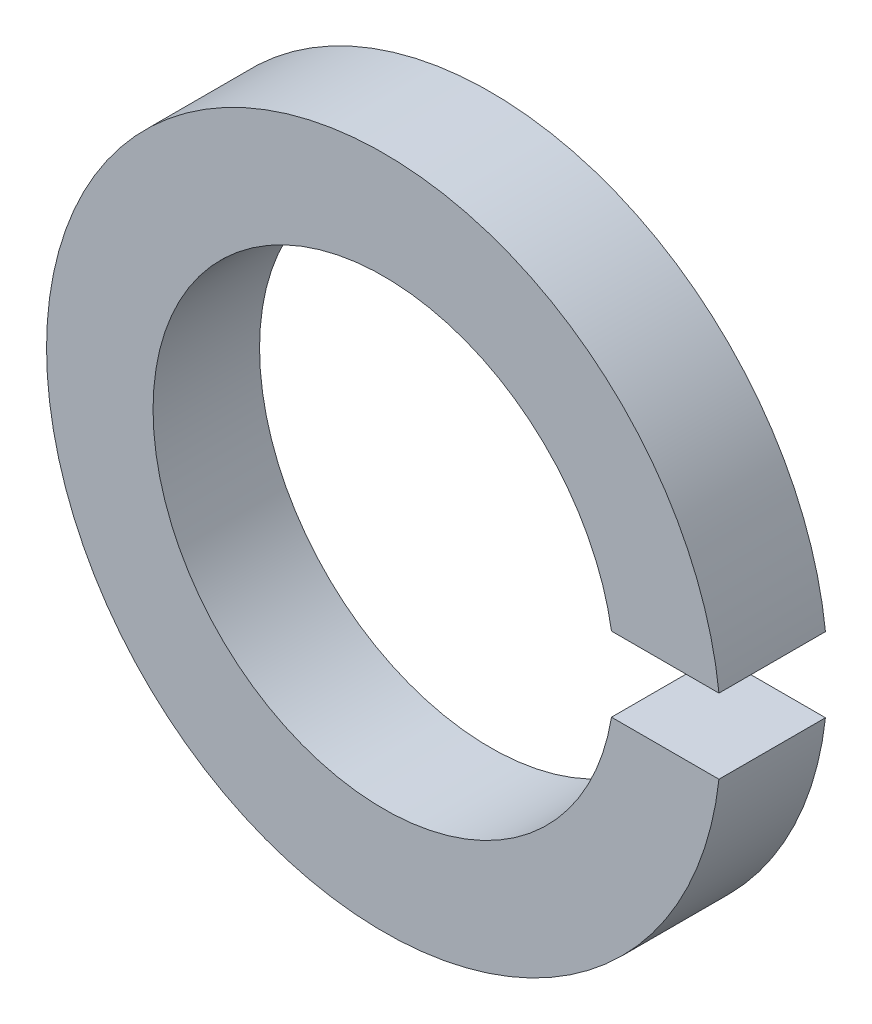
ISO-10303-21;
HEADER;
FILE_DESCRIPTION(('STEP AP214'),'2;1');
FILE_NAME('part.step','',(''),(''),'','','');
FILE_SCHEMA(('AUTOMOTIVE_DESIGN { 1 0 10303 214 1 1 1 1 }'));
ENDSEC;
DATA;
#1=APPLICATION_CONTEXT('core data for automotive mechanical design processes');
#2=APPLICATION_PROTOCOL_DEFINITION('international standard','automotive_design',2000,#1);
#3=PRODUCT_CONTEXT('',#1,'mechanical');
#4=PRODUCT('Part','Part','',(#3));
#5=PRODUCT_RELATED_PRODUCT_CATEGORY('part','',(#4));
#6=PRODUCT_DEFINITION_FORMATION('','',#4);
#7=PRODUCT_DEFINITION_CONTEXT('part definition',#1,'design');
#8=PRODUCT_DEFINITION('design','',#6,#7);
#9=PRODUCT_DEFINITION_SHAPE('','',#8);
#10=(LENGTH_UNIT() NAMED_UNIT(*) SI_UNIT(.MILLI.,.METRE.));
#11=(NAMED_UNIT(*) PLANE_ANGLE_UNIT() SI_UNIT($,.RADIAN.));
#12=(NAMED_UNIT(*) SI_UNIT($,.STERADIAN.) SOLID_ANGLE_UNIT());
#13=UNCERTAINTY_MEASURE_WITH_UNIT(LENGTH_MEASURE(1.E-05),#10,'distance_accuracy_value','');
#14=(GEOMETRIC_REPRESENTATION_CONTEXT(3) GLOBAL_UNCERTAINTY_ASSIGNED_CONTEXT((#13)) GLOBAL_UNIT_ASSIGNED_CONTEXT((#10,
#11,#12)) REPRESENTATION_CONTEXT('',''));
#15=CARTESIAN_POINT('',(0.,0.,0.));
#16=DIRECTION('',(0.,0.,1.));
#17=DIRECTION('',(1.,0.,0.));
#18=AXIS2_PLACEMENT_3D('',#15,#16,#17);
#19=CARTESIAN_POINT('',(0.,0.,0.6));
#20=DIRECTION('',(0.,0.,1.));
#21=DIRECTION('',(1.,0.,0.));
#22=AXIS2_PLACEMENT_3D('',#19,#20,#21);
#23=PLANE('',#22);
#24=DIRECTION('',(-1.,0.,0.));
#25=VECTOR('',#24,1.);
#26=CARTESIAN_POINT('',(1.07176359278806,0.21,0.6));
#27=LINE('',#26,#25);
#28=CARTESIAN_POINT('',(1.88835907602341,0.21,0.6));
#29=VERTEX_POINT('',#28);
#30=CARTESIAN_POINT('',(1.28292634239071,0.21,0.6));
#31=VERTEX_POINT('',#30);
#32=EDGE_CURVE('E51',#29,#31,#27,.T.);
#33=ORIENTED_EDGE('',*,*,#32,.F.);
#34=CARTESIAN_POINT('',(0.,0.,0.6));
#35=DIRECTION('',(0.,0.,1.));
#36=DIRECTION('',(1.,0.,0.));
#37=AXIS2_PLACEMENT_3D('',#34,#35,#36);
#38=CIRCLE('',#37,1.9);
#39=CARTESIAN_POINT('',(1.88835907602341,-0.21,0.6));
#40=VERTEX_POINT('',#39);
#41=EDGE_CURVE('E74',#29,#40,#38,.T.);
#42=ORIENTED_EDGE('',*,*,#41,.T.);
#43=DIRECTION('',(1.,0.,0.));
#44=VECTOR('',#43,1.);
#45=CARTESIAN_POINT('',(1.07176359278806,-0.21,0.6));
#46=LINE('',#45,#44);
#47=CARTESIAN_POINT('',(1.28292634239071,-0.21,0.6));
#48=VERTEX_POINT('',#47);
#49=EDGE_CURVE('E68',#48,#40,#46,.T.);
#50=ORIENTED_EDGE('',*,*,#49,.F.);
#51=CARTESIAN_POINT('',(0.,0.,0.6));
#52=DIRECTION('',(0.,0.,1.));
#53=DIRECTION('',(1.,0.,0.));
#54=AXIS2_PLACEMENT_3D('',#51,#52,#53);
#55=CIRCLE('',#54,1.3);
#56=EDGE_CURVE('E78',#31,#48,#55,.T.);
#57=ORIENTED_EDGE('',*,*,#56,.F.);
#58=EDGE_LOOP('',(#33,#42,#50,#57));
#59=FACE_BOUND('',#58,.T.);
#60=ADVANCED_FACE('F29',(#59),#23,.T.);
#61=CARTESIAN_POINT('',(0.,0.,0.));
#62=DIRECTION('',(0.,0.,1.));
#63=DIRECTION('',(1.,0.,0.));
#64=AXIS2_PLACEMENT_3D('',#61,#62,#63);
#65=PLANE('',#64);
#66=CARTESIAN_POINT('',(0.,0.,0.));
#67=DIRECTION('',(0.,0.,1.));
#68=DIRECTION('',(1.,0.,0.));
#69=AXIS2_PLACEMENT_3D('',#66,#67,#68);
#70=CIRCLE('',#69,1.9);
#71=CARTESIAN_POINT('',(1.88835907602341,0.21,0.));
#72=VERTEX_POINT('',#71);
#73=CARTESIAN_POINT('',(1.88835907602341,-0.21,0.));
#74=VERTEX_POINT('',#73);
#75=EDGE_CURVE('E82',#72,#74,#70,.T.);
#76=ORIENTED_EDGE('',*,*,#75,.F.);
#77=DIRECTION('',(-1.,0.,0.));
#78=VECTOR('',#77,1.);
#79=CARTESIAN_POINT('',(1.07176359278806,0.21,0.));
#80=LINE('',#79,#78);
#81=CARTESIAN_POINT('',(1.28292634239071,0.21,0.));
#82=VERTEX_POINT('',#81);
#83=EDGE_CURVE('E95',#72,#82,#80,.T.);
#84=ORIENTED_EDGE('',*,*,#83,.T.);
#85=CARTESIAN_POINT('',(0.,0.,0.));
#86=DIRECTION('',(0.,0.,1.));
#87=DIRECTION('',(1.,0.,0.));
#88=AXIS2_PLACEMENT_3D('',#85,#86,#87);
#89=CIRCLE('',#88,1.3);
#90=CARTESIAN_POINT('',(1.28292634239071,-0.21,0.));
#91=VERTEX_POINT('',#90);
#92=EDGE_CURVE('E83',#82,#91,#89,.T.);
#93=ORIENTED_EDGE('',*,*,#92,.T.);
#94=DIRECTION('',(1.,0.,0.));
#95=VECTOR('',#94,1.);
#96=CARTESIAN_POINT('',(1.07176359278806,-0.21,0.));
#97=LINE('',#96,#95);
#98=EDGE_CURVE('E44',#91,#74,#97,.T.);
#99=ORIENTED_EDGE('',*,*,#98,.T.);
#100=EDGE_LOOP('',(#76,#84,#93,#99));
#101=FACE_BOUND('',#100,.T.);
#102=ADVANCED_FACE('F101',(#101),#65,.F.);
#103=CARTESIAN_POINT('',(0.,0.,0.6));
#104=DIRECTION('',(0.,0.,-1.));
#105=DIRECTION('',(-1.,0.,0.));
#106=AXIS2_PLACEMENT_3D('',#103,#104,#105);
#107=CYLINDRICAL_SURFACE('',#106,1.9);
#108=ORIENTED_EDGE('',*,*,#41,.F.);
#109=DIRECTION('',(0.,0.,-1.));
#110=VECTOR('',#109,1.);
#111=CARTESIAN_POINT('',(1.88835907602341,0.21,0.6));
#112=LINE('',#111,#110);
#113=EDGE_CURVE('E87',#29,#72,#112,.T.);
#114=ORIENTED_EDGE('',*,*,#113,.T.);
#115=ORIENTED_EDGE('',*,*,#75,.T.);
#116=DIRECTION('',(0.,0.,-1.));
#117=VECTOR('',#116,1.);
#118=CARTESIAN_POINT('',(1.88835907602341,-0.21,0.6));
#119=LINE('',#118,#117);
#120=EDGE_CURVE('E93',#74,#40,#119,.F.);
#121=ORIENTED_EDGE('',*,*,#120,.T.);
#122=EDGE_LOOP('',(#108,#114,#115,#121));
#123=FACE_BOUND('',#122,.T.);
#124=ADVANCED_FACE('F31',(#123),#107,.T.);
#125=CARTESIAN_POINT('',(0.,0.,0.6));
#126=DIRECTION('',(0.,0.,-1.));
#127=DIRECTION('',(-1.,0.,0.));
#128=AXIS2_PLACEMENT_3D('',#125,#126,#127);
#129=CYLINDRICAL_SURFACE('',#128,1.3);
#130=DIRECTION('',(0.,0.,-1.));
#131=VECTOR('',#130,1.);
#132=CARTESIAN_POINT('',(1.28292634239071,0.21,0.6));
#133=LINE('',#132,#131);
#134=EDGE_CURVE('E11',#31,#82,#133,.T.);
#135=ORIENTED_EDGE('',*,*,#134,.F.);
#136=ORIENTED_EDGE('',*,*,#56,.T.);
#137=DIRECTION('',(0.,0.,-1.));
#138=VECTOR('',#137,1.);
#139=CARTESIAN_POINT('',(1.28292634239071,-0.21,0.6));
#140=LINE('',#139,#138);
#141=EDGE_CURVE('E37',#91,#48,#140,.F.);
#142=ORIENTED_EDGE('',*,*,#141,.F.);
#143=ORIENTED_EDGE('',*,*,#92,.F.);
#144=EDGE_LOOP('',(#135,#136,#142,#143));
#145=FACE_BOUND('',#144,.T.);
#146=ADVANCED_FACE('F81',(#145),#129,.F.);
#147=CARTESIAN_POINT('',(1.07176359278806,-0.21,0.));
#148=DIRECTION('',(0.,-1.,0.));
#149=DIRECTION('',(0.,0.,-1.));
#150=AXIS2_PLACEMENT_3D('',#147,#148,#149);
#151=PLANE('',#150);
#152=ORIENTED_EDGE('',*,*,#98,.F.);
#153=ORIENTED_EDGE('',*,*,#141,.T.);
#154=ORIENTED_EDGE('',*,*,#49,.T.);
#155=ORIENTED_EDGE('',*,*,#120,.F.);
#156=EDGE_LOOP('',(#152,#153,#154,#155));
#157=FACE_BOUND('',#156,.T.);
#158=ADVANCED_FACE('F67',(#157),#151,.F.);
#159=CARTESIAN_POINT('',(1.07176359278806,0.21,0.));
#160=DIRECTION('',(0.,1.,0.));
#161=DIRECTION('',(0.,0.,1.));
#162=AXIS2_PLACEMENT_3D('',#159,#160,#161);
#163=PLANE('',#162);
#164=ORIENTED_EDGE('',*,*,#32,.T.);
#165=ORIENTED_EDGE('',*,*,#134,.T.);
#166=ORIENTED_EDGE('',*,*,#83,.F.);
#167=ORIENTED_EDGE('',*,*,#113,.F.);
#168=EDGE_LOOP('',(#164,#165,#166,#167));
#169=FACE_BOUND('',#168,.T.);
#170=ADVANCED_FACE('F103',(#169),#163,.F.);
#171=CLOSED_SHELL('',(#60,#102,#124,#146,#158,#170));
#172=MANIFOLD_SOLID_BREP('B2',#171);
#173=ADVANCED_BREP_SHAPE_REPRESENTATION('',(#18,#172),#14);
#174=SHAPE_DEFINITION_REPRESENTATION(#9,#173);
ENDSEC;
END-ISO-10303-21;
